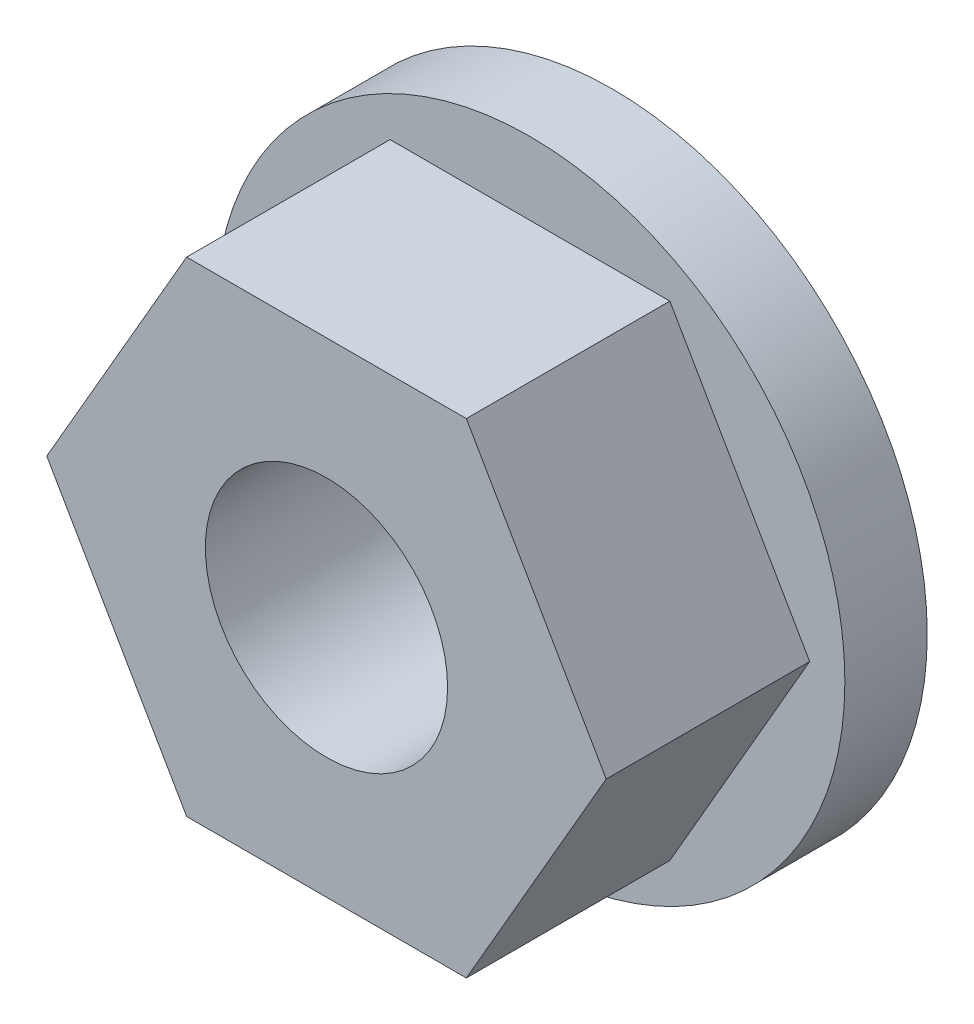
ISO-10303-21;
HEADER;
FILE_DESCRIPTION(('STEP AP214'),'2;1');
FILE_NAME('part.step','',(''),(''),'','','');
FILE_SCHEMA(('AUTOMOTIVE_DESIGN { 1 0 10303 214 1 1 1 1 }'));
ENDSEC;
DATA;
#1=APPLICATION_CONTEXT('core data for automotive mechanical design processes');
#2=APPLICATION_PROTOCOL_DEFINITION('international standard','automotive_design',2000,#1);
#3=PRODUCT_CONTEXT('',#1,'mechanical');
#4=PRODUCT('Part','Part','',(#3));
#5=PRODUCT_RELATED_PRODUCT_CATEGORY('part','',(#4));
#6=PRODUCT_DEFINITION_FORMATION('','',#4);
#7=PRODUCT_DEFINITION_CONTEXT('part definition',#1,'design');
#8=PRODUCT_DEFINITION('design','',#6,#7);
#9=PRODUCT_DEFINITION_SHAPE('','',#8);
#10=(LENGTH_UNIT() NAMED_UNIT(*) SI_UNIT(.MILLI.,.METRE.));
#11=(NAMED_UNIT(*) PLANE_ANGLE_UNIT() SI_UNIT($,.RADIAN.));
#12=(NAMED_UNIT(*) SI_UNIT($,.STERADIAN.) SOLID_ANGLE_UNIT());
#13=UNCERTAINTY_MEASURE_WITH_UNIT(LENGTH_MEASURE(1.E-05),#10,'distance_accuracy_value','');
#14=(GEOMETRIC_REPRESENTATION_CONTEXT(3) GLOBAL_UNCERTAINTY_ASSIGNED_CONTEXT((#13)) GLOBAL_UNIT_ASSIGNED_CONTEXT((#10,
#11,#12)) REPRESENTATION_CONTEXT('',''));
#15=CARTESIAN_POINT('',(0.,0.,0.));
#16=DIRECTION('',(0.,0.,1.));
#17=DIRECTION('',(1.,0.,0.));
#18=AXIS2_PLACEMENT_3D('',#15,#16,#17);
#19=CARTESIAN_POINT('',(0.,0.,1.7));
#20=DIRECTION('',(0.,0.,-1.));
#21=DIRECTION('',(-1.,0.,0.));
#22=AXIS2_PLACEMENT_3D('',#19,#20,#21);
#23=CYLINDRICAL_SURFACE('',#22,6.5);
#24=CARTESIAN_POINT('',(0.,0.,1.7));
#25=DIRECTION('',(0.,0.,1.));
#26=DIRECTION('',(1.,0.,0.));
#27=AXIS2_PLACEMENT_3D('',#24,#25,#26);
#28=CIRCLE('',#27,6.5);
#29=CARTESIAN_POINT('',(6.5,0.,1.7));
#30=VERTEX_POINT('',#29);
#31=EDGE_CURVE('E12',#30,#30,#28,.T.);
#32=ORIENTED_EDGE('',*,*,#31,.F.);
#33=EDGE_LOOP('',(#32));
#34=FACE_BOUND('',#33,.T.);
#35=CARTESIAN_POINT('',(0.,0.,0.));
#36=DIRECTION('',(0.,0.,1.));
#37=DIRECTION('',(1.,0.,0.));
#38=AXIS2_PLACEMENT_3D('',#35,#36,#37);
#39=CIRCLE('',#38,6.5);
#40=CARTESIAN_POINT('',(6.5,0.,0.));
#41=VERTEX_POINT('',#40);
#42=EDGE_CURVE('E40',#41,#41,#39,.T.);
#43=ORIENTED_EDGE('',*,*,#42,.T.);
#44=EDGE_LOOP('',(#43));
#45=FACE_BOUND('',#44,.T.);
#46=ADVANCED_FACE('F37',(#34,#45),#23,.T.);
#47=CARTESIAN_POINT('',(0.,0.,1.7));
#48=DIRECTION('',(0.,0.,1.));
#49=DIRECTION('',(1.,0.,0.));
#50=AXIS2_PLACEMENT_3D('',#47,#48,#49);
#51=PLANE('',#50);
#52=DIRECTION('',(0.5,0.866025403784439,0.));
#53=VECTOR('',#52,1.);
#54=CARTESIAN_POINT('',(2.88675134594813,-5.,1.7));
#55=LINE('',#54,#53);
#56=CARTESIAN_POINT('',(2.88675134594813,-5.,1.7));
#57=VERTEX_POINT('',#56);
#58=CARTESIAN_POINT('',(5.77350269189626,0.,1.7));
#59=VERTEX_POINT('',#58);
#60=EDGE_CURVE('E51',#57,#59,#55,.T.);
#61=ORIENTED_EDGE('',*,*,#60,.F.);
#62=DIRECTION('',(1.,0.,0.));
#63=VECTOR('',#62,1.);
#64=CARTESIAN_POINT('',(-2.88675134594813,-5.,1.7));
#65=LINE('',#64,#63);
#66=CARTESIAN_POINT('',(-2.88675134594813,-5.,1.7));
#67=VERTEX_POINT('',#66);
#68=EDGE_CURVE('E56',#67,#57,#65,.T.);
#69=ORIENTED_EDGE('',*,*,#68,.F.);
#70=DIRECTION('',(0.5,-0.866025403784439,0.));
#71=VECTOR('',#70,1.);
#72=CARTESIAN_POINT('',(-5.77350269189626,0.,1.7));
#73=LINE('',#72,#71);
#74=CARTESIAN_POINT('',(-5.77350269189626,0.,1.7));
#75=VERTEX_POINT('',#74);
#76=EDGE_CURVE('E94',#75,#67,#73,.T.);
#77=ORIENTED_EDGE('',*,*,#76,.F.);
#78=DIRECTION('',(-0.5,-0.866025403784439,0.));
#79=VECTOR('',#78,1.);
#80=CARTESIAN_POINT('',(-2.88675134594813,5.,1.7));
#81=LINE('',#80,#79);
#82=CARTESIAN_POINT('',(-2.88675134594813,5.,1.7));
#83=VERTEX_POINT('',#82);
#84=EDGE_CURVE('E133',#83,#75,#81,.T.);
#85=ORIENTED_EDGE('',*,*,#84,.F.);
#86=DIRECTION('',(-1.,0.,0.));
#87=VECTOR('',#86,1.);
#88=CARTESIAN_POINT('',(2.88675134594813,5.,1.7));
#89=LINE('',#88,#87);
#90=CARTESIAN_POINT('',(2.88675134594813,5.,1.7));
#91=VERTEX_POINT('',#90);
#92=EDGE_CURVE('E129',#91,#83,#89,.T.);
#93=ORIENTED_EDGE('',*,*,#92,.F.);
#94=DIRECTION('',(-0.5,0.866025403784438,0.));
#95=VECTOR('',#94,1.);
#96=CARTESIAN_POINT('',(5.77350269189626,0.,1.7));
#97=LINE('',#96,#95);
#98=EDGE_CURVE('E125',#59,#91,#97,.T.);
#99=ORIENTED_EDGE('',*,*,#98,.F.);
#100=EDGE_LOOP('',(#61,#69,#77,#85,#93,#99));
#101=FACE_BOUND('',#100,.T.);
#102=ORIENTED_EDGE('',*,*,#31,.T.);
#103=EDGE_LOOP('',(#102));
#104=FACE_BOUND('',#103,.T.);
#105=ADVANCED_FACE('F156',(#101,#104),#51,.T.);
#106=CARTESIAN_POINT('',(0.,0.,0.));
#107=DIRECTION('',(0.,0.,1.));
#108=DIRECTION('',(1.,0.,0.));
#109=AXIS2_PLACEMENT_3D('',#106,#107,#108);
#110=PLANE('',#109);
#111=CARTESIAN_POINT('',(0.,0.,0.));
#112=DIRECTION('',(0.,0.,1.));
#113=DIRECTION('',(1.,0.,0.));
#114=AXIS2_PLACEMENT_3D('',#111,#112,#113);
#115=CIRCLE('',#114,2.5);
#116=CARTESIAN_POINT('',(2.5,0.,0.));
#117=VERTEX_POINT('',#116);
#118=EDGE_CURVE('E136',#117,#117,#115,.T.);
#119=ORIENTED_EDGE('',*,*,#118,.T.);
#120=EDGE_LOOP('',(#119));
#121=FACE_BOUND('',#120,.T.);
#122=ORIENTED_EDGE('',*,*,#42,.F.);
#123=EDGE_LOOP('',(#122));
#124=FACE_BOUND('',#123,.T.);
#125=ADVANCED_FACE('F163',(#121,#124),#110,.F.);
#126=CARTESIAN_POINT('',(2.88675134594813,-5.,27.0752523165195));
#127=DIRECTION('',(-0.866025403784439,0.5,0.));
#128=DIRECTION('',(-0.5,-0.866025403784439,0.));
#129=AXIS2_PLACEMENT_3D('',#126,#127,#128);
#130=PLANE('',#129);
#131=DIRECTION('',(0.5,0.866025403784439,0.));
#132=VECTOR('',#131,1.);
#133=CARTESIAN_POINT('',(2.88675134594813,-5.,5.9));
#134=LINE('',#133,#132);
#135=CARTESIAN_POINT('',(2.88675134594813,-5.,5.9));
#136=VERTEX_POINT('',#135);
#137=CARTESIAN_POINT('',(5.77350269189626,0.,5.9));
#138=VERTEX_POINT('',#137);
#139=EDGE_CURVE('E104',#136,#138,#134,.T.);
#140=ORIENTED_EDGE('',*,*,#139,.F.);
#141=DIRECTION('',(0.,0.,-1.));
#142=VECTOR('',#141,1.);
#143=CARTESIAN_POINT('',(2.88675134594813,-5.,27.0752523165195));
#144=LINE('',#143,#142);
#145=EDGE_CURVE('E100',#136,#57,#144,.T.);
#146=ORIENTED_EDGE('',*,*,#145,.T.);
#147=ORIENTED_EDGE('',*,*,#60,.T.);
#148=DIRECTION('',(0.,0.,-1.));
#149=VECTOR('',#148,1.);
#150=CARTESIAN_POINT('',(5.77350269189626,0.,27.0752523165195));
#151=LINE('',#150,#149);
#152=EDGE_CURVE('E122',#138,#59,#151,.T.);
#153=ORIENTED_EDGE('',*,*,#152,.F.);
#154=EDGE_LOOP('',(#140,#146,#147,#153));
#155=FACE_BOUND('',#154,.T.);
#156=ADVANCED_FACE('F161',(#155),#130,.F.);
#157=CARTESIAN_POINT('',(5.77350269189626,0.,27.0752523165195));
#158=DIRECTION('',(-0.866025403784439,-0.5,0.));
#159=DIRECTION('',(0.5,-0.866025403784439,0.));
#160=AXIS2_PLACEMENT_3D('',#157,#158,#159);
#161=PLANE('',#160);
#162=DIRECTION('',(-0.5,0.866025403784439,0.));
#163=VECTOR('',#162,1.);
#164=CARTESIAN_POINT('',(5.77350269189626,0.,5.9));
#165=LINE('',#164,#163);
#166=CARTESIAN_POINT('',(2.88675134594813,5.,5.9));
#167=VERTEX_POINT('',#166);
#168=EDGE_CURVE('E118',#138,#167,#165,.T.);
#169=ORIENTED_EDGE('',*,*,#168,.F.);
#170=ORIENTED_EDGE('',*,*,#152,.T.);
#171=ORIENTED_EDGE('',*,*,#98,.T.);
#172=DIRECTION('',(0.,0.,-1.));
#173=VECTOR('',#172,1.);
#174=CARTESIAN_POINT('',(2.88675134594813,5.,27.0752523165195));
#175=LINE('',#174,#173);
#176=EDGE_CURVE('E126',#167,#91,#175,.T.);
#177=ORIENTED_EDGE('',*,*,#176,.F.);
#178=EDGE_LOOP('',(#169,#170,#171,#177));
#179=FACE_BOUND('',#178,.T.);
#180=ADVANCED_FACE('F154',(#179),#161,.F.);
#181=CARTESIAN_POINT('',(2.88675134594813,5.,27.0752523165195));
#182=DIRECTION('',(0.,-1.,0.));
#183=DIRECTION('',(0.,0.,-1.));
#184=AXIS2_PLACEMENT_3D('',#181,#182,#183);
#185=PLANE('',#184);
#186=DIRECTION('',(-1.,0.,0.));
#187=VECTOR('',#186,1.);
#188=CARTESIAN_POINT('',(2.88675134594813,5.,5.9));
#189=LINE('',#188,#187);
#190=CARTESIAN_POINT('',(-2.88675134594813,5.,5.9));
#191=VERTEX_POINT('',#190);
#192=EDGE_CURVE('E112',#167,#191,#189,.T.);
#193=ORIENTED_EDGE('',*,*,#192,.F.);
#194=ORIENTED_EDGE('',*,*,#176,.T.);
#195=ORIENTED_EDGE('',*,*,#92,.T.);
#196=DIRECTION('',(0.,0.,-1.));
#197=VECTOR('',#196,1.);
#198=CARTESIAN_POINT('',(-2.88675134594813,5.,27.0752523165195));
#199=LINE('',#198,#197);
#200=EDGE_CURVE('E130',#191,#83,#199,.T.);
#201=ORIENTED_EDGE('',*,*,#200,.F.);
#202=EDGE_LOOP('',(#193,#194,#195,#201));
#203=FACE_BOUND('',#202,.T.);
#204=ADVANCED_FACE('F160',(#203),#185,.F.);
#205=CARTESIAN_POINT('',(-2.88675134594813,5.,27.0752523165195));
#206=DIRECTION('',(0.866025403784439,-0.5,0.));
#207=DIRECTION('',(0.5,0.866025403784439,0.));
#208=AXIS2_PLACEMENT_3D('',#205,#206,#207);
#209=PLANE('',#208);
#210=DIRECTION('',(-0.5,-0.866025403784439,0.));
#211=VECTOR('',#210,1.);
#212=CARTESIAN_POINT('',(-2.88675134594813,5.,5.9));
#213=LINE('',#212,#211);
#214=CARTESIAN_POINT('',(-5.77350269189626,0.,5.9));
#215=VERTEX_POINT('',#214);
#216=EDGE_CURVE('E109',#191,#215,#213,.T.);
#217=ORIENTED_EDGE('',*,*,#216,.F.);
#218=ORIENTED_EDGE('',*,*,#200,.T.);
#219=ORIENTED_EDGE('',*,*,#84,.T.);
#220=DIRECTION('',(0.,0.,-1.));
#221=VECTOR('',#220,1.);
#222=CARTESIAN_POINT('',(-5.77350269189626,0.,27.0752523165195));
#223=LINE('',#222,#221);
#224=EDGE_CURVE('E134',#215,#75,#223,.T.);
#225=ORIENTED_EDGE('',*,*,#224,.F.);
#226=EDGE_LOOP('',(#217,#218,#219,#225));
#227=FACE_BOUND('',#226,.T.);
#228=ADVANCED_FACE('F200',(#227),#209,.F.);
#229=CARTESIAN_POINT('',(-5.77350269189626,0.,27.0752523165195));
#230=DIRECTION('',(0.866025403784439,0.5,0.));
#231=DIRECTION('',(-0.5,0.866025403784439,0.));
#232=AXIS2_PLACEMENT_3D('',#229,#230,#231);
#233=PLANE('',#232);
#234=DIRECTION('',(0.5,-0.866025403784439,0.));
#235=VECTOR('',#234,1.);
#236=CARTESIAN_POINT('',(-5.77350269189626,0.,5.9));
#237=LINE('',#236,#235);
#238=CARTESIAN_POINT('',(-2.88675134594813,-5.,5.9));
#239=VERTEX_POINT('',#238);
#240=EDGE_CURVE('E92',#215,#239,#237,.T.);
#241=ORIENTED_EDGE('',*,*,#240,.F.);
#242=ORIENTED_EDGE('',*,*,#224,.T.);
#243=ORIENTED_EDGE('',*,*,#76,.T.);
#244=DIRECTION('',(0.,0.,-1.));
#245=VECTOR('',#244,1.);
#246=CARTESIAN_POINT('',(-2.88675134594813,-5.,27.0752523165195));
#247=LINE('',#246,#245);
#248=EDGE_CURVE('E87',#239,#67,#247,.T.);
#249=ORIENTED_EDGE('',*,*,#248,.F.);
#250=EDGE_LOOP('',(#241,#242,#243,#249));
#251=FACE_BOUND('',#250,.T.);
#252=ADVANCED_FACE('F89',(#251),#233,.F.);
#253=CARTESIAN_POINT('',(-2.88675134594813,-5.,27.0752523165195));
#254=DIRECTION('',(0.,1.,0.));
#255=DIRECTION('',(0.,0.,1.));
#256=AXIS2_PLACEMENT_3D('',#253,#254,#255);
#257=PLANE('',#256);
#258=DIRECTION('',(1.,0.,0.));
#259=VECTOR('',#258,1.);
#260=CARTESIAN_POINT('',(-2.88675134594813,-5.,5.9));
#261=LINE('',#260,#259);
#262=EDGE_CURVE('E98',#239,#136,#261,.T.);
#263=ORIENTED_EDGE('',*,*,#262,.F.);
#264=ORIENTED_EDGE('',*,*,#248,.T.);
#265=ORIENTED_EDGE('',*,*,#68,.T.);
#266=ORIENTED_EDGE('',*,*,#145,.F.);
#267=EDGE_LOOP('',(#263,#264,#265,#266));
#268=FACE_BOUND('',#267,.T.);
#269=ADVANCED_FACE('F99',(#268),#257,.F.);
#270=CARTESIAN_POINT('',(0.,0.,5.9));
#271=DIRECTION('',(0.,0.,1.));
#272=DIRECTION('',(1.,0.,0.));
#273=AXIS2_PLACEMENT_3D('',#270,#271,#272);
#274=PLANE('',#273);
#275=CARTESIAN_POINT('',(0.,0.,5.9));
#276=DIRECTION('',(0.,0.,1.));
#277=DIRECTION('',(1.,0.,0.));
#278=AXIS2_PLACEMENT_3D('',#275,#276,#277);
#279=CIRCLE('',#278,2.5);
#280=CARTESIAN_POINT('',(2.5,0.,5.9));
#281=VERTEX_POINT('',#280);
#282=EDGE_CURVE('E139',#281,#281,#279,.T.);
#283=ORIENTED_EDGE('',*,*,#282,.F.);
#284=EDGE_LOOP('',(#283));
#285=FACE_BOUND('',#284,.T.);
#286=ORIENTED_EDGE('',*,*,#262,.T.);
#287=ORIENTED_EDGE('',*,*,#139,.T.);
#288=ORIENTED_EDGE('',*,*,#168,.T.);
#289=ORIENTED_EDGE('',*,*,#192,.T.);
#290=ORIENTED_EDGE('',*,*,#216,.T.);
#291=ORIENTED_EDGE('',*,*,#240,.T.);
#292=EDGE_LOOP('',(#286,#287,#288,#289,#290,#291));
#293=FACE_BOUND('',#292,.T.);
#294=ADVANCED_FACE('F107',(#285,#293),#274,.T.);
#295=CARTESIAN_POINT('',(0.,0.,0.));
#296=DIRECTION('',(0.,0.,1.));
#297=DIRECTION('',(1.,0.,0.));
#298=AXIS2_PLACEMENT_3D('',#295,#296,#297);
#299=CYLINDRICAL_SURFACE('',#298,2.5);
#300=ORIENTED_EDGE('',*,*,#118,.F.);
#301=EDGE_LOOP('',(#300));
#302=FACE_BOUND('',#301,.T.);
#303=ORIENTED_EDGE('',*,*,#282,.T.);
#304=EDGE_LOOP('',(#303));
#305=FACE_BOUND('',#304,.T.);
#306=ADVANCED_FACE('F185',(#302,#305),#299,.F.);
#307=CLOSED_SHELL('',(#46,#105,#125,#156,#180,#204,#228,#252,#269,#294,#306));
#308=MANIFOLD_SOLID_BREP('B2',#307);
#309=ADVANCED_BREP_SHAPE_REPRESENTATION('',(#18,#308),#14);
#310=SHAPE_DEFINITION_REPRESENTATION(#9,#309);
ENDSEC;
END-ISO-10303-21;
